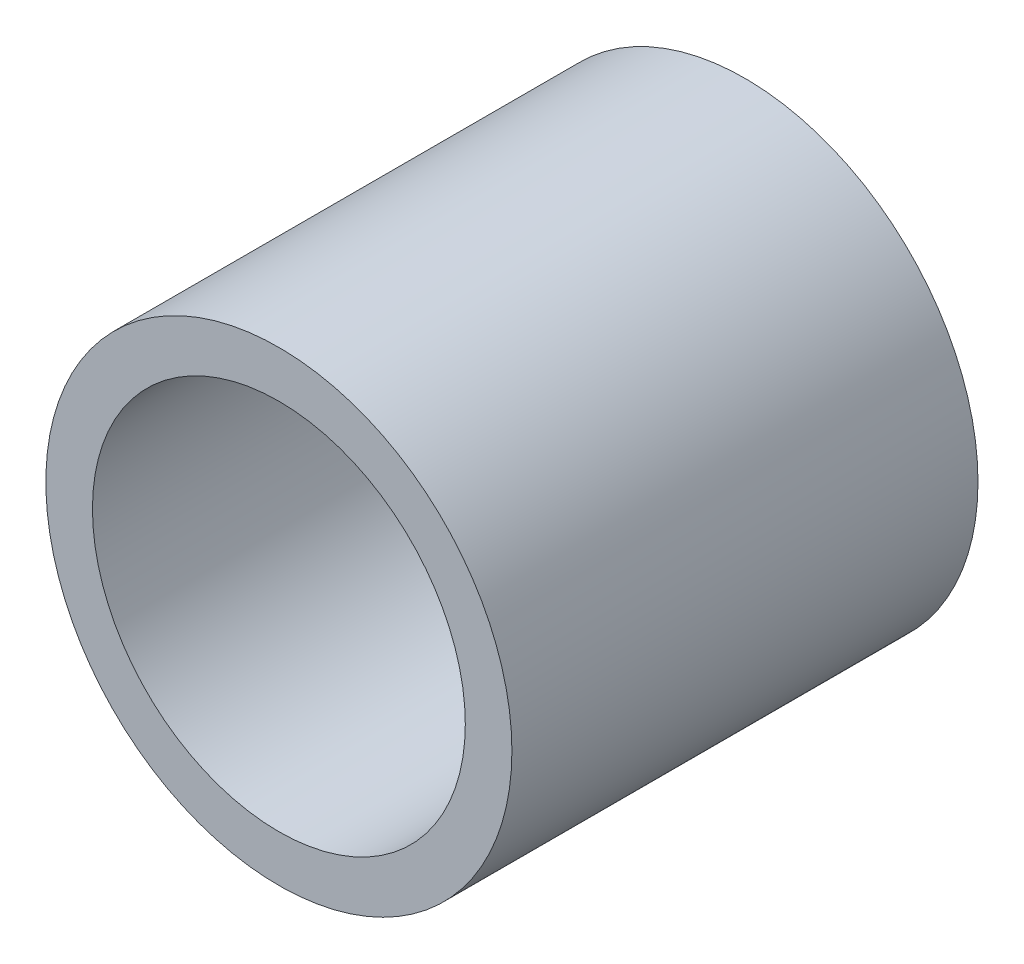
ISO-10303-21;
HEADER;
FILE_DESCRIPTION(('STEP AP214'),'2;1');
FILE_NAME('part.step','',(''),(''),'','','');
FILE_SCHEMA(('AUTOMOTIVE_DESIGN { 1 0 10303 214 1 1 1 1 }'));
ENDSEC;
DATA;
#1=APPLICATION_CONTEXT('core data for automotive mechanical design processes');
#2=APPLICATION_PROTOCOL_DEFINITION('international standard','automotive_design',2000,#1);
#3=PRODUCT_CONTEXT('',#1,'mechanical');
#4=PRODUCT('Part','Part','',(#3));
#5=PRODUCT_RELATED_PRODUCT_CATEGORY('part','',(#4));
#6=PRODUCT_DEFINITION_FORMATION('','',#4);
#7=PRODUCT_DEFINITION_CONTEXT('part definition',#1,'design');
#8=PRODUCT_DEFINITION('design','',#6,#7);
#9=PRODUCT_DEFINITION_SHAPE('','',#8);
#10=(LENGTH_UNIT() NAMED_UNIT(*) SI_UNIT(.MILLI.,.METRE.));
#11=(NAMED_UNIT(*) PLANE_ANGLE_UNIT() SI_UNIT($,.RADIAN.));
#12=(NAMED_UNIT(*) SI_UNIT($,.STERADIAN.) SOLID_ANGLE_UNIT());
#13=UNCERTAINTY_MEASURE_WITH_UNIT(LENGTH_MEASURE(1.E-05),#10,'distance_accuracy_value','');
#14=(GEOMETRIC_REPRESENTATION_CONTEXT(3) GLOBAL_UNCERTAINTY_ASSIGNED_CONTEXT((#13)) GLOBAL_UNIT_ASSIGNED_CONTEXT((#10,
#11,#12)) REPRESENTATION_CONTEXT('',''));
#15=CARTESIAN_POINT('',(0.,0.,0.));
#16=DIRECTION('',(0.,0.,1.));
#17=DIRECTION('',(1.,0.,0.));
#18=AXIS2_PLACEMENT_3D('',#15,#16,#17);
#19=CARTESIAN_POINT('',(0.,0.,5.5));
#20=DIRECTION('',(0.,0.,1.));
#21=DIRECTION('',(1.,0.,0.));
#22=AXIS2_PLACEMENT_3D('',#19,#20,#21);
#23=PLANE('',#22);
#24=CARTESIAN_POINT('',(0.,0.,5.5));
#25=DIRECTION('',(0.,0.,1.));
#26=DIRECTION('',(1.,0.,0.));
#27=AXIS2_PLACEMENT_3D('',#24,#25,#26);
#28=CIRCLE('',#27,2.75);
#29=CARTESIAN_POINT('',(2.75,0.,5.5));
#30=VERTEX_POINT('',#29);
#31=EDGE_CURVE('E10',#30,#30,#28,.T.);
#32=ORIENTED_EDGE('',*,*,#31,.T.);
#33=EDGE_LOOP('',(#32));
#34=FACE_BOUND('',#33,.T.);
#35=CARTESIAN_POINT('',(0.,0.,5.5));
#36=DIRECTION('',(0.,0.,1.));
#37=DIRECTION('',(1.,0.,0.));
#38=AXIS2_PLACEMENT_3D('',#35,#36,#37);
#39=CIRCLE('',#38,2.2);
#40=CARTESIAN_POINT('',(2.2,0.,5.5));
#41=VERTEX_POINT('',#40);
#42=EDGE_CURVE('E42',#41,#41,#39,.T.);
#43=ORIENTED_EDGE('',*,*,#42,.F.);
#44=EDGE_LOOP('',(#43));
#45=FACE_BOUND('',#44,.T.);
#46=ADVANCED_FACE('F31',(#34,#45),#23,.T.);
#47=CARTESIAN_POINT('',(0.,0.,0.));
#48=DIRECTION('',(0.,0.,1.));
#49=DIRECTION('',(1.,0.,0.));
#50=AXIS2_PLACEMENT_3D('',#47,#48,#49);
#51=PLANE('',#50);
#52=CARTESIAN_POINT('',(0.,0.,0.));
#53=DIRECTION('',(0.,0.,1.));
#54=DIRECTION('',(1.,0.,0.));
#55=AXIS2_PLACEMENT_3D('',#52,#53,#54);
#56=CIRCLE('',#55,2.75);
#57=CARTESIAN_POINT('',(2.75,0.,0.));
#58=VERTEX_POINT('',#57);
#59=EDGE_CURVE('E35',#58,#58,#56,.T.);
#60=ORIENTED_EDGE('',*,*,#59,.F.);
#61=EDGE_LOOP('',(#60));
#62=FACE_BOUND('',#61,.T.);
#63=CARTESIAN_POINT('',(0.,0.,0.));
#64=DIRECTION('',(0.,0.,1.));
#65=DIRECTION('',(1.,0.,0.));
#66=AXIS2_PLACEMENT_3D('',#63,#64,#65);
#67=CIRCLE('',#66,2.2);
#68=CARTESIAN_POINT('',(2.2,0.,0.));
#69=VERTEX_POINT('',#68);
#70=EDGE_CURVE('E44',#69,#69,#67,.T.);
#71=ORIENTED_EDGE('',*,*,#70,.T.);
#72=EDGE_LOOP('',(#71));
#73=FACE_BOUND('',#72,.T.);
#74=ADVANCED_FACE('F54',(#62,#73),#51,.F.);
#75=CARTESIAN_POINT('',(0.,0.,5.5));
#76=DIRECTION('',(0.,0.,-1.));
#77=DIRECTION('',(-1.,0.,0.));
#78=AXIS2_PLACEMENT_3D('',#75,#76,#77);
#79=CYLINDRICAL_SURFACE('',#78,2.75);
#80=ORIENTED_EDGE('',*,*,#31,.F.);
#81=EDGE_LOOP('',(#80));
#82=FACE_BOUND('',#81,.T.);
#83=ORIENTED_EDGE('',*,*,#59,.T.);
#84=EDGE_LOOP('',(#83));
#85=FACE_BOUND('',#84,.T.);
#86=ADVANCED_FACE('F33',(#82,#85),#79,.T.);
#87=CARTESIAN_POINT('',(0.,0.,5.5));
#88=DIRECTION('',(0.,0.,-1.));
#89=DIRECTION('',(-1.,0.,0.));
#90=AXIS2_PLACEMENT_3D('',#87,#88,#89);
#91=CYLINDRICAL_SURFACE('',#90,2.2);
#92=ORIENTED_EDGE('',*,*,#42,.T.);
#93=EDGE_LOOP('',(#92));
#94=FACE_BOUND('',#93,.T.);
#95=ORIENTED_EDGE('',*,*,#70,.F.);
#96=EDGE_LOOP('',(#95));
#97=FACE_BOUND('',#96,.T.);
#98=ADVANCED_FACE('F50',(#94,#97),#91,.F.);
#99=CLOSED_SHELL('',(#46,#74,#86,#98));
#100=MANIFOLD_SOLID_BREP('B2',#99);
#101=ADVANCED_BREP_SHAPE_REPRESENTATION('',(#18,#100),#14);
#102=SHAPE_DEFINITION_REPRESENTATION(#9,#101);
ENDSEC;
END-ISO-10303-21;
